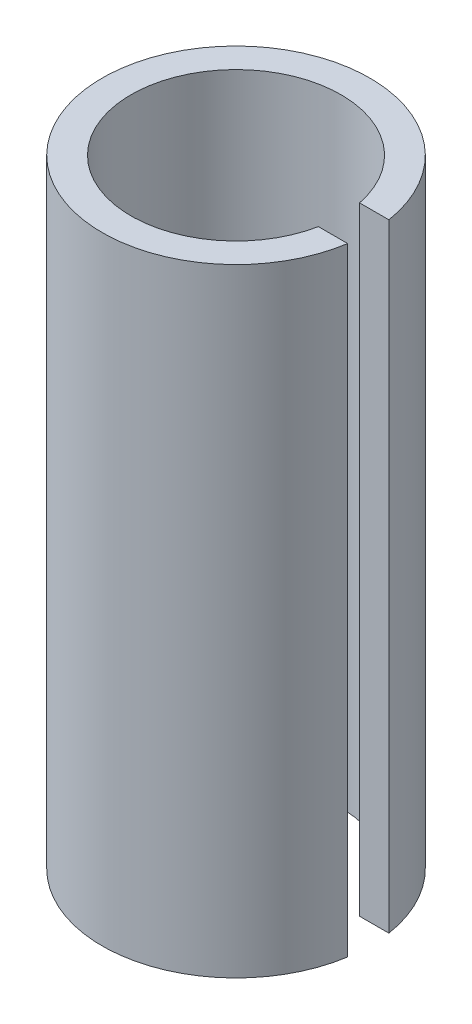
ISO-10303-21;
HEADER;
FILE_DESCRIPTION(('STEP AP214'),'2;1');
FILE_NAME('part.step','',(''),(''),'','','');
FILE_SCHEMA(('AUTOMOTIVE_DESIGN { 1 0 10303 214 1 1 1 1 }'));
ENDSEC;
DATA;
#1=APPLICATION_CONTEXT('core data for automotive mechanical design processes');
#2=APPLICATION_PROTOCOL_DEFINITION('international standard','automotive_design',2000,#1);
#3=PRODUCT_CONTEXT('',#1,'mechanical');
#4=PRODUCT('Part','Part','',(#3));
#5=PRODUCT_RELATED_PRODUCT_CATEGORY('part','',(#4));
#6=PRODUCT_DEFINITION_FORMATION('','',#4);
#7=PRODUCT_DEFINITION_CONTEXT('part definition',#1,'design');
#8=PRODUCT_DEFINITION('design','',#6,#7);
#9=PRODUCT_DEFINITION_SHAPE('','',#8);
#10=(LENGTH_UNIT() NAMED_UNIT(*) SI_UNIT(.MILLI.,.METRE.));
#11=(NAMED_UNIT(*) PLANE_ANGLE_UNIT() SI_UNIT($,.RADIAN.));
#12=(NAMED_UNIT(*) SI_UNIT($,.STERADIAN.) SOLID_ANGLE_UNIT());
#13=UNCERTAINTY_MEASURE_WITH_UNIT(LENGTH_MEASURE(1.E-05),#10,'distance_accuracy_value','');
#14=(GEOMETRIC_REPRESENTATION_CONTEXT(3) GLOBAL_UNCERTAINTY_ASSIGNED_CONTEXT((#13)) GLOBAL_UNIT_ASSIGNED_CONTEXT((#10,
#11,#12)) REPRESENTATION_CONTEXT('',''));
#15=CARTESIAN_POINT('',(0.,0.,0.));
#16=DIRECTION('',(0.,0.,1.));
#17=DIRECTION('',(1.,0.,0.));
#18=AXIS2_PLACEMENT_3D('',#15,#16,#17);
#19=CARTESIAN_POINT('',(0.,15.,0.));
#20=DIRECTION('',(0.,-1.,0.));
#21=DIRECTION('',(0.,0.,-1.));
#22=AXIS2_PLACEMENT_3D('',#19,#20,#21);
#23=CYLINDRICAL_SURFACE('',#22,2.55);
#24=CARTESIAN_POINT('',(0.,0.,0.));
#25=DIRECTION('',(0.,1.,0.));
#26=DIRECTION('',(0.,0.,1.));
#27=AXIS2_PLACEMENT_3D('',#24,#25,#26);
#28=CIRCLE('',#27,2.55);
#29=CARTESIAN_POINT('',(2.50049995001,0.,-0.5));
#30=VERTEX_POINT('',#29);
#31=CARTESIAN_POINT('',(2.50049995001,0.,0.5));
#32=VERTEX_POINT('',#31);
#33=EDGE_CURVE('E104',#30,#32,#28,.T.);
#34=ORIENTED_EDGE('',*,*,#33,.F.);
#35=DIRECTION('',(0.,-1.,0.));
#36=VECTOR('',#35,1.);
#37=CARTESIAN_POINT('',(2.50049995001,15.,-0.5));
#38=LINE('',#37,#36);
#39=CARTESIAN_POINT('',(2.50049995001,15.,-0.5));
#40=VERTEX_POINT('',#39);
#41=EDGE_CURVE('E11',#40,#30,#38,.T.);
#42=ORIENTED_EDGE('',*,*,#41,.F.);
#43=CARTESIAN_POINT('',(0.,15.,0.));
#44=DIRECTION('',(0.,1.,0.));
#45=DIRECTION('',(0.,0.,1.));
#46=AXIS2_PLACEMENT_3D('',#43,#44,#45);
#47=CIRCLE('',#46,2.55);
#48=CARTESIAN_POINT('',(2.50049995001,15.,0.5));
#49=VERTEX_POINT('',#48);
#50=EDGE_CURVE('E89',#40,#49,#47,.T.);
#51=ORIENTED_EDGE('',*,*,#50,.T.);
#52=DIRECTION('',(0.,-1.,0.));
#53=VECTOR('',#52,1.);
#54=CARTESIAN_POINT('',(2.50049995001,15.,0.5));
#55=LINE('',#54,#53);
#56=EDGE_CURVE('E57',#49,#32,#55,.T.);
#57=ORIENTED_EDGE('',*,*,#56,.T.);
#58=EDGE_LOOP('',(#34,#42,#51,#57));
#59=FACE_BOUND('',#58,.T.);
#60=ADVANCED_FACE('F41',(#59),#23,.F.);
#61=CARTESIAN_POINT('',(0.,15.,-0.5));
#62=DIRECTION('',(0.,0.,-1.));
#63=DIRECTION('',(-1.,0.,0.));
#64=AXIS2_PLACEMENT_3D('',#61,#62,#63);
#65=PLANE('',#64);
#66=DIRECTION('',(1.,0.,0.));
#67=VECTOR('',#66,1.);
#68=CARTESIAN_POINT('',(0.,0.,-0.5));
#69=LINE('',#68,#67);
#70=CARTESIAN_POINT('',(3.21130814466628,0.,-0.5));
#71=VERTEX_POINT('',#70);
#72=EDGE_CURVE('E95',#30,#71,#69,.T.);
#73=ORIENTED_EDGE('',*,*,#72,.T.);
#74=DIRECTION('',(0.,-1.,0.));
#75=VECTOR('',#74,1.);
#76=CARTESIAN_POINT('',(3.21130814466628,15.,-0.5));
#77=LINE('',#76,#75);
#78=CARTESIAN_POINT('',(3.21130814466628,15.,-0.5));
#79=VERTEX_POINT('',#78);
#80=EDGE_CURVE('E49',#79,#71,#77,.T.);
#81=ORIENTED_EDGE('',*,*,#80,.F.);
#82=DIRECTION('',(1.,0.,0.));
#83=VECTOR('',#82,1.);
#84=CARTESIAN_POINT('',(0.,15.,-0.5));
#85=LINE('',#84,#83);
#86=EDGE_CURVE('E83',#40,#79,#85,.T.);
#87=ORIENTED_EDGE('',*,*,#86,.F.);
#88=ORIENTED_EDGE('',*,*,#41,.T.);
#89=EDGE_LOOP('',(#73,#81,#87,#88));
#90=FACE_BOUND('',#89,.T.);
#91=ADVANCED_FACE('F93',(#90),#65,.F.);
#92=CARTESIAN_POINT('',(0.,15.,0.));
#93=DIRECTION('',(0.,-1.,0.));
#94=DIRECTION('',(0.,0.,-1.));
#95=AXIS2_PLACEMENT_3D('',#92,#93,#94);
#96=CYLINDRICAL_SURFACE('',#95,3.25);
#97=CARTESIAN_POINT('',(0.,0.,0.));
#98=DIRECTION('',(0.,1.,0.));
#99=DIRECTION('',(0.,0.,1.));
#100=AXIS2_PLACEMENT_3D('',#97,#98,#99);
#101=CIRCLE('',#100,3.25);
#102=CARTESIAN_POINT('',(3.21130814466628,0.,0.5));
#103=VERTEX_POINT('',#102);
#104=EDGE_CURVE('E107',#71,#103,#101,.T.);
#105=ORIENTED_EDGE('',*,*,#104,.T.);
#106=DIRECTION('',(0.,-1.,0.));
#107=VECTOR('',#106,1.);
#108=CARTESIAN_POINT('',(3.21130814466628,15.,0.5));
#109=LINE('',#108,#107);
#110=CARTESIAN_POINT('',(3.21130814466628,15.,0.5));
#111=VERTEX_POINT('',#110);
#112=EDGE_CURVE('E71',#111,#103,#109,.T.);
#113=ORIENTED_EDGE('',*,*,#112,.F.);
#114=CARTESIAN_POINT('',(0.,15.,0.));
#115=DIRECTION('',(0.,1.,0.));
#116=DIRECTION('',(0.,0.,1.));
#117=AXIS2_PLACEMENT_3D('',#114,#115,#116);
#118=CIRCLE('',#117,3.25);
#119=EDGE_CURVE('E88',#79,#111,#118,.T.);
#120=ORIENTED_EDGE('',*,*,#119,.F.);
#121=ORIENTED_EDGE('',*,*,#80,.T.);
#122=EDGE_LOOP('',(#105,#113,#120,#121));
#123=FACE_BOUND('',#122,.T.);
#124=ADVANCED_FACE('F98',(#123),#96,.T.);
#125=CARTESIAN_POINT('',(0.,15.,0.5));
#126=DIRECTION('',(0.,0.,-1.));
#127=DIRECTION('',(-1.,0.,0.));
#128=AXIS2_PLACEMENT_3D('',#125,#126,#127);
#129=PLANE('',#128);
#130=DIRECTION('',(1.,0.,0.));
#131=VECTOR('',#130,1.);
#132=CARTESIAN_POINT('',(0.,0.,0.5));
#133=LINE('',#132,#131);
#134=EDGE_CURVE('E109',#32,#103,#133,.T.);
#135=ORIENTED_EDGE('',*,*,#134,.F.);
#136=ORIENTED_EDGE('',*,*,#56,.F.);
#137=DIRECTION('',(1.,0.,0.));
#138=VECTOR('',#137,1.);
#139=CARTESIAN_POINT('',(0.,15.,0.5));
#140=LINE('',#139,#138);
#141=EDGE_CURVE('E99',#49,#111,#140,.T.);
#142=ORIENTED_EDGE('',*,*,#141,.T.);
#143=ORIENTED_EDGE('',*,*,#112,.T.);
#144=EDGE_LOOP('',(#135,#136,#142,#143));
#145=FACE_BOUND('',#144,.T.);
#146=ADVANCED_FACE('F114',(#145),#129,.T.);
#147=CARTESIAN_POINT('',(0.,15.,0.));
#148=DIRECTION('',(0.,1.,0.));
#149=DIRECTION('',(0.,0.,1.));
#150=AXIS2_PLACEMENT_3D('',#147,#148,#149);
#151=PLANE('',#150);
#152=ORIENTED_EDGE('',*,*,#50,.F.);
#153=ORIENTED_EDGE('',*,*,#86,.T.);
#154=ORIENTED_EDGE('',*,*,#119,.T.);
#155=ORIENTED_EDGE('',*,*,#141,.F.);
#156=EDGE_LOOP('',(#152,#153,#154,#155));
#157=FACE_BOUND('',#156,.T.);
#158=ADVANCED_FACE('F85',(#157),#151,.T.);
#159=CARTESIAN_POINT('',(0.,0.,0.));
#160=DIRECTION('',(0.,1.,0.));
#161=DIRECTION('',(0.,0.,1.));
#162=AXIS2_PLACEMENT_3D('',#159,#160,#161);
#163=PLANE('',#162);
#164=ORIENTED_EDGE('',*,*,#33,.T.);
#165=ORIENTED_EDGE('',*,*,#134,.T.);
#166=ORIENTED_EDGE('',*,*,#104,.F.);
#167=ORIENTED_EDGE('',*,*,#72,.F.);
#168=EDGE_LOOP('',(#164,#165,#166,#167));
#169=FACE_BOUND('',#168,.T.);
#170=ADVANCED_FACE('F121',(#169),#163,.F.);
#171=CLOSED_SHELL('',(#60,#91,#124,#146,#158,#170));
#172=MANIFOLD_SOLID_BREP('B2',#171);
#173=ADVANCED_BREP_SHAPE_REPRESENTATION('',(#18,#172),#14);
#174=SHAPE_DEFINITION_REPRESENTATION(#9,#173);
ENDSEC;
END-ISO-10303-21;
